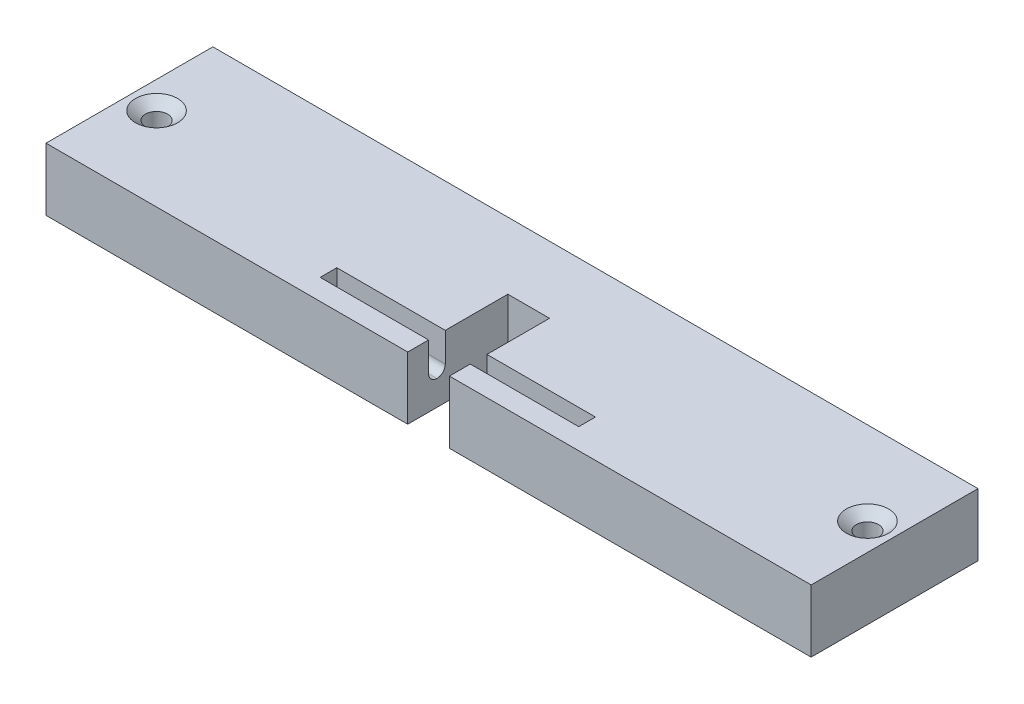
ISO-10303-21;
HEADER;
FILE_DESCRIPTION(('STEP AP214'),'2;1');
FILE_NAME('part.step','',(''),(''),'','','');
FILE_SCHEMA(('AUTOMOTIVE_DESIGN { 1 0 10303 214 1 1 1 1 }'));
ENDSEC;
DATA;
#1=APPLICATION_CONTEXT('core data for automotive mechanical design processes');
#2=APPLICATION_PROTOCOL_DEFINITION('international standard','automotive_design',2000,#1);
#3=PRODUCT_CONTEXT('',#1,'mechanical');
#4=PRODUCT('Part','Part','',(#3));
#5=PRODUCT_RELATED_PRODUCT_CATEGORY('part','',(#4));
#6=PRODUCT_DEFINITION_FORMATION('','',#4);
#7=PRODUCT_DEFINITION_CONTEXT('part definition',#1,'design');
#8=PRODUCT_DEFINITION('design','',#6,#7);
#9=PRODUCT_DEFINITION_SHAPE('','',#8);
#10=(LENGTH_UNIT() NAMED_UNIT(*) SI_UNIT(.MILLI.,.METRE.));
#11=(NAMED_UNIT(*) PLANE_ANGLE_UNIT() SI_UNIT($,.RADIAN.));
#12=(NAMED_UNIT(*) SI_UNIT($,.STERADIAN.) SOLID_ANGLE_UNIT());
#13=UNCERTAINTY_MEASURE_WITH_UNIT(LENGTH_MEASURE(1.E-05),#10,'distance_accuracy_value','');
#14=(GEOMETRIC_REPRESENTATION_CONTEXT(3) GLOBAL_UNCERTAINTY_ASSIGNED_CONTEXT((#13)) GLOBAL_UNIT_ASSIGNED_CONTEXT((#10,
#11,#12)) REPRESENTATION_CONTEXT('',''));
#15=CARTESIAN_POINT('',(0.,0.,0.));
#16=DIRECTION('',(0.,0.,1.));
#17=DIRECTION('',(1.,0.,0.));
#18=AXIS2_PLACEMENT_3D('',#15,#16,#17);
#19=CARTESIAN_POINT('',(-45.86,82.5,-0.0100000000000031));
#20=DIRECTION('',(0.,-1.,0.));
#21=DIRECTION('',(0.,0.,-1.));
#22=AXIS2_PLACEMENT_3D('',#19,#20,#21);
#23=PLANE('',#22);
#24=DIRECTION('',(0.,0.,1.));
#25=VECTOR('',#24,1.);
#26=CARTESIAN_POINT('',(-38.36,82.5,15.));
#27=LINE('',#26,#25);
#28=CARTESIAN_POINT('',(-38.36,82.5,4.99999999999998));
#29=VERTEX_POINT('',#28);
#30=CARTESIAN_POINT('',(-38.36,82.5,15.));
#31=VERTEX_POINT('',#30);
#32=EDGE_CURVE('E217',#29,#31,#27,.T.);
#33=ORIENTED_EDGE('',*,*,#32,.F.);
#34=DIRECTION('',(-0.499999999999998,0.,-0.86602540378444));
#35=VECTOR('',#34,1.);
#36=CARTESIAN_POINT('',(-38.36,82.5,5.));
#37=LINE('',#36,#35);
#38=CARTESIAN_POINT('',(-39.86,82.5,2.40192378864667));
#39=VERTEX_POINT('',#38);
#40=EDGE_CURVE('E246',#29,#39,#37,.T.);
#41=ORIENTED_EDGE('',*,*,#40,.T.);
#42=DIRECTION('',(0.,0.,-1.));
#43=VECTOR('',#42,1.);
#44=CARTESIAN_POINT('',(-39.86,82.5,0.));
#45=LINE('',#44,#43);
#46=CARTESIAN_POINT('',(-39.86,82.5,17.5980762113533));
#47=VERTEX_POINT('',#46);
#48=EDGE_CURVE('E243',#47,#39,#45,.T.);
#49=ORIENTED_EDGE('',*,*,#48,.F.);
#50=DIRECTION('',(0.499999999999998,0.,-0.86602540378444));
#51=VECTOR('',#50,1.);
#52=CARTESIAN_POINT('',(-38.36,82.5,15.));
#53=LINE('',#52,#51);
#54=EDGE_CURVE('E236',#47,#31,#53,.T.);
#55=ORIENTED_EDGE('',*,*,#54,.T.);
#56=EDGE_LOOP('',(#33,#41,#49,#55));
#57=FACE_BOUND('',#56,.T.);
#58=DIRECTION('',(-0.499999999999998,0.,0.86602540378444));
#59=VECTOR('',#58,1.);
#60=CARTESIAN_POINT('',(38.36,82.5,5.));
#61=LINE('',#60,#59);
#62=CARTESIAN_POINT('',(38.36,82.5,5.));
#63=VERTEX_POINT('',#62);
#64=CARTESIAN_POINT('',(39.86,82.5,2.40192378864667));
#65=VERTEX_POINT('',#64);
#66=EDGE_CURVE('E371',#63,#65,#61,.F.);
#67=ORIENTED_EDGE('',*,*,#66,.F.);
#68=DIRECTION('',(0.,0.,1.));
#69=VECTOR('',#68,1.);
#70=CARTESIAN_POINT('',(38.36,82.5,15.));
#71=LINE('',#70,#69);
#72=CARTESIAN_POINT('',(38.36,82.5,15.));
#73=VERTEX_POINT('',#72);
#74=EDGE_CURVE('E316',#63,#73,#71,.T.);
#75=ORIENTED_EDGE('',*,*,#74,.T.);
#76=DIRECTION('',(0.499999999999998,0.,0.86602540378444));
#77=VECTOR('',#76,1.);
#78=CARTESIAN_POINT('',(38.36,82.5,15.));
#79=LINE('',#78,#77);
#80=CARTESIAN_POINT('',(39.86,82.5,17.5980762113533));
#81=VERTEX_POINT('',#80);
#82=EDGE_CURVE('E374',#81,#73,#79,.F.);
#83=ORIENTED_EDGE('',*,*,#82,.F.);
#84=DIRECTION('',(0.,0.,1.));
#85=VECTOR('',#84,1.);
#86=CARTESIAN_POINT('',(39.86,82.5,0.));
#87=LINE('',#86,#85);
#88=EDGE_CURVE('E367',#65,#81,#87,.T.);
#89=ORIENTED_EDGE('',*,*,#88,.F.);
#90=EDGE_LOOP('',(#67,#75,#83,#89));
#91=FACE_BOUND('',#90,.T.);
#92=CARTESIAN_POINT('',(42.61,82.5,10.));
#93=DIRECTION('',(0.,-1.,0.));
#94=DIRECTION('',(0.,0.,-1.));
#95=AXIS2_PLACEMENT_3D('',#92,#93,#94);
#96=CIRCLE('',#95,1.3208);
#97=CARTESIAN_POINT('',(42.61,82.5,8.6792));
#98=VERTEX_POINT('',#97);
#99=EDGE_CURVE('E259',#98,#98,#96,.F.);
#100=ORIENTED_EDGE('',*,*,#99,.T.);
#101=EDGE_LOOP('',(#100));
#102=FACE_BOUND('',#101,.T.);
#103=DIRECTION('',(1.,0.,0.));
#104=VECTOR('',#103,1.);
#105=CARTESIAN_POINT('',(-38.36,82.5,0.));
#106=LINE('',#105,#104);
#107=CARTESIAN_POINT('',(-45.86,82.5,0.));
#108=VERTEX_POINT('',#107);
#109=CARTESIAN_POINT('',(45.86,82.5,0.));
#110=VERTEX_POINT('',#109);
#111=EDGE_CURVE('E545',#108,#110,#106,.T.);
#112=ORIENTED_EDGE('',*,*,#111,.T.);
#113=DIRECTION('',(0.,0.,1.));
#114=VECTOR('',#113,1.);
#115=CARTESIAN_POINT('',(45.86,82.5,-0.0100000000000031));
#116=LINE('',#115,#114);
#117=CARTESIAN_POINT('',(45.86,82.5,20.));
#118=VERTEX_POINT('',#117);
#119=EDGE_CURVE('E252',#110,#118,#116,.T.);
#120=ORIENTED_EDGE('',*,*,#119,.T.);
#121=DIRECTION('',(-1.,0.,0.));
#122=VECTOR('',#121,1.);
#123=CARTESIAN_POINT('',(38.36,82.5,20.));
#124=LINE('',#123,#122);
#125=CARTESIAN_POINT('',(2.49999999999999,82.5,20.));
#126=VERTEX_POINT('',#125);
#127=EDGE_CURVE('E293',#118,#126,#124,.T.);
#128=ORIENTED_EDGE('',*,*,#127,.T.);
#129=DIRECTION('',(0.,0.,-1.));
#130=VECTOR('',#129,1.);
#131=CARTESIAN_POINT('',(2.49999999999999,82.5,20.));
#132=LINE('',#131,#130);
#133=CARTESIAN_POINT('',(2.49999999999999,82.5,8.));
#134=VERTEX_POINT('',#133);
#135=EDGE_CURVE('E319',#126,#134,#132,.T.);
#136=ORIENTED_EDGE('',*,*,#135,.T.);
#137=DIRECTION('',(1.,0.,0.));
#138=VECTOR('',#137,1.);
#139=CARTESIAN_POINT('',(-2.50000000000001,82.5,8.));
#140=LINE('',#139,#138);
#141=CARTESIAN_POINT('',(-2.50000000000001,82.5,8.));
#142=VERTEX_POINT('',#141);
#143=EDGE_CURVE('E389',#142,#134,#140,.T.);
#144=ORIENTED_EDGE('',*,*,#143,.F.);
#145=DIRECTION('',(0.,0.,-1.));
#146=VECTOR('',#145,1.);
#147=CARTESIAN_POINT('',(-2.50000000000001,82.5,20.));
#148=LINE('',#147,#146);
#149=CARTESIAN_POINT('',(-2.50000000000001,82.5,20.));
#150=VERTEX_POINT('',#149);
#151=EDGE_CURVE('E403',#150,#142,#148,.T.);
#152=ORIENTED_EDGE('',*,*,#151,.F.);
#153=DIRECTION('',(1.,0.,0.));
#154=VECTOR('',#153,1.);
#155=CARTESIAN_POINT('',(-38.36,82.5,20.));
#156=LINE('',#155,#154);
#157=CARTESIAN_POINT('',(-45.86,82.5,20.));
#158=VERTEX_POINT('',#157);
#159=EDGE_CURVE('E240',#158,#150,#156,.T.);
#160=ORIENTED_EDGE('',*,*,#159,.F.);
#161=DIRECTION('',(0.,0.,-1.));
#162=VECTOR('',#161,1.);
#163=CARTESIAN_POINT('',(-45.86,82.5,20.));
#164=LINE('',#163,#162);
#165=EDGE_CURVE('E245',#158,#108,#164,.T.);
#166=ORIENTED_EDGE('',*,*,#165,.T.);
#167=EDGE_LOOP('',(#112,#120,#128,#136,#144,#152,#160,#166));
#168=FACE_BOUND('',#167,.T.);
#169=CARTESIAN_POINT('',(-42.61,82.5,10.));
#170=DIRECTION('',(0.,-1.,0.));
#171=DIRECTION('',(0.,0.,-1.));
#172=AXIS2_PLACEMENT_3D('',#169,#170,#171);
#173=CIRCLE('',#172,1.3208);
#174=CARTESIAN_POINT('',(-42.61,82.5,8.6792));
#175=VERTEX_POINT('',#174);
#176=EDGE_CURVE('E263',#175,#175,#173,.F.);
#177=ORIENTED_EDGE('',*,*,#176,.T.);
#178=EDGE_LOOP('',(#177));
#179=FACE_BOUND('',#178,.T.);
#180=ADVANCED_FACE('F47',(#57,#91,#102,#168,#179),#23,.T.);
#181=CARTESIAN_POINT('',(-45.86,90.,20.));
#182=DIRECTION('',(0.,1.,0.));
#183=DIRECTION('',(0.,0.,1.));
#184=AXIS2_PLACEMENT_3D('',#181,#182,#183);
#185=PLANE('',#184);
#186=CARTESIAN_POINT('',(-42.61,90.,10.));
#187=DIRECTION('',(0.,1.,0.));
#188=DIRECTION('',(0.,0.,1.));
#189=AXIS2_PLACEMENT_3D('',#186,#187,#188);
#190=CIRCLE('',#189,2.5273);
#191=CARTESIAN_POINT('',(-42.61,90.,12.5273));
#192=VERTEX_POINT('',#191);
#193=EDGE_CURVE('E11',#192,#192,#190,.T.);
#194=ORIENTED_EDGE('',*,*,#193,.F.);
#195=EDGE_LOOP('',(#194));
#196=FACE_BOUND('',#195,.T.);
#197=CARTESIAN_POINT('',(42.61,90.,10.));
#198=DIRECTION('',(0.,1.,0.));
#199=DIRECTION('',(0.,0.,1.));
#200=AXIS2_PLACEMENT_3D('',#197,#198,#199);
#201=CIRCLE('',#200,2.5273);
#202=CARTESIAN_POINT('',(42.61,90.,12.5273));
#203=VERTEX_POINT('',#202);
#204=EDGE_CURVE('E360',#203,#203,#201,.T.);
#205=ORIENTED_EDGE('',*,*,#204,.F.);
#206=EDGE_LOOP('',(#205));
#207=FACE_BOUND('',#206,.T.);
#208=DIRECTION('',(0.,0.,1.));
#209=VECTOR('',#208,1.);
#210=CARTESIAN_POINT('',(2.49999999999999,90.,20.));
#211=LINE('',#210,#209);
#212=CARTESIAN_POINT('',(2.49999999999999,90.,8.));
#213=VERTEX_POINT('',#212);
#214=CARTESIAN_POINT('',(2.49999999999999,90.,15.5));
#215=VERTEX_POINT('',#214);
#216=EDGE_CURVE('E327',#213,#215,#211,.T.);
#217=ORIENTED_EDGE('',*,*,#216,.T.);
#218=DIRECTION('',(-1.,0.,0.));
#219=VECTOR('',#218,1.);
#220=CARTESIAN_POINT('',(15.5,90.,15.5));
#221=LINE('',#220,#219);
#222=CARTESIAN_POINT('',(15.5,90.,15.5));
#223=VERTEX_POINT('',#222);
#224=EDGE_CURVE('E335',#223,#215,#221,.T.);
#225=ORIENTED_EDGE('',*,*,#224,.F.);
#226=DIRECTION('',(0.,0.,1.));
#227=VECTOR('',#226,1.);
#228=CARTESIAN_POINT('',(15.5,90.,17.5));
#229=LINE('',#228,#227);
#230=CARTESIAN_POINT('',(15.5,90.,17.5));
#231=VERTEX_POINT('',#230);
#232=EDGE_CURVE('E339',#223,#231,#229,.T.);
#233=ORIENTED_EDGE('',*,*,#232,.T.);
#234=DIRECTION('',(-1.,0.,0.));
#235=VECTOR('',#234,1.);
#236=CARTESIAN_POINT('',(15.5,90.,17.5));
#237=LINE('',#236,#235);
#238=CARTESIAN_POINT('',(2.49999999999999,90.,17.5));
#239=VERTEX_POINT('',#238);
#240=EDGE_CURVE('E336',#231,#239,#237,.T.);
#241=ORIENTED_EDGE('',*,*,#240,.T.);
#242=CARTESIAN_POINT('',(2.49999999999999,90.,20.));
#243=VERTEX_POINT('',#242);
#244=EDGE_CURVE('E86',#239,#243,#211,.T.);
#245=ORIENTED_EDGE('',*,*,#244,.T.);
#246=DIRECTION('',(-1.,0.,0.));
#247=VECTOR('',#246,1.);
#248=CARTESIAN_POINT('',(45.86,90.,20.));
#249=LINE('',#248,#247);
#250=CARTESIAN_POINT('',(45.86,90.,20.));
#251=VERTEX_POINT('',#250);
#252=EDGE_CURVE('E288',#251,#243,#249,.T.);
#253=ORIENTED_EDGE('',*,*,#252,.F.);
#254=DIRECTION('',(0.,0.,-1.));
#255=VECTOR('',#254,1.);
#256=CARTESIAN_POINT('',(45.86,90.,20.));
#257=LINE('',#256,#255);
#258=CARTESIAN_POINT('',(45.86,90.,0.));
#259=VERTEX_POINT('',#258);
#260=EDGE_CURVE('E289',#251,#259,#257,.T.);
#261=ORIENTED_EDGE('',*,*,#260,.T.);
#262=DIRECTION('',(1.,0.,0.));
#263=VECTOR('',#262,1.);
#264=CARTESIAN_POINT('',(-45.86,90.,0.));
#265=LINE('',#264,#263);
#266=CARTESIAN_POINT('',(-45.86,90.,0.));
#267=VERTEX_POINT('',#266);
#268=EDGE_CURVE('E277',#267,#259,#265,.T.);
#269=ORIENTED_EDGE('',*,*,#268,.F.);
#270=DIRECTION('',(0.,0.,-1.));
#271=VECTOR('',#270,1.);
#272=CARTESIAN_POINT('',(-45.86,90.,20.));
#273=LINE('',#272,#271);
#274=CARTESIAN_POINT('',(-45.86,90.,20.));
#275=VERTEX_POINT('',#274);
#276=EDGE_CURVE('E272',#275,#267,#273,.T.);
#277=ORIENTED_EDGE('',*,*,#276,.F.);
#278=DIRECTION('',(1.,0.,0.));
#279=VECTOR('',#278,1.);
#280=CARTESIAN_POINT('',(-45.86,90.,20.));
#281=LINE('',#280,#279);
#282=CARTESIAN_POINT('',(-2.50000000000001,90.,20.));
#283=VERTEX_POINT('',#282);
#284=EDGE_CURVE('E271',#275,#283,#281,.T.);
#285=ORIENTED_EDGE('',*,*,#284,.T.);
#286=DIRECTION('',(0.,0.,1.));
#287=VECTOR('',#286,1.);
#288=CARTESIAN_POINT('',(-2.50000000000001,90.,20.));
#289=LINE('',#288,#287);
#290=CARTESIAN_POINT('',(-2.50000000000001,90.,17.5));
#291=VERTEX_POINT('',#290);
#292=EDGE_CURVE('E398',#291,#283,#289,.T.);
#293=ORIENTED_EDGE('',*,*,#292,.F.);
#294=DIRECTION('',(1.,0.,0.));
#295=VECTOR('',#294,1.);
#296=CARTESIAN_POINT('',(-15.5,90.,17.5));
#297=LINE('',#296,#295);
#298=CARTESIAN_POINT('',(-15.5,90.,17.5));
#299=VERTEX_POINT('',#298);
#300=EDGE_CURVE('E410',#299,#291,#297,.T.);
#301=ORIENTED_EDGE('',*,*,#300,.F.);
#302=DIRECTION('',(0.,0.,1.));
#303=VECTOR('',#302,1.);
#304=CARTESIAN_POINT('',(-15.5,90.,17.5));
#305=LINE('',#304,#303);
#306=CARTESIAN_POINT('',(-15.5,90.,15.5));
#307=VERTEX_POINT('',#306);
#308=EDGE_CURVE('E429',#307,#299,#305,.T.);
#309=ORIENTED_EDGE('',*,*,#308,.F.);
#310=DIRECTION('',(1.,0.,0.));
#311=VECTOR('',#310,1.);
#312=CARTESIAN_POINT('',(-15.5,90.,15.5));
#313=LINE('',#312,#311);
#314=CARTESIAN_POINT('',(-2.50000000000001,90.,15.5));
#315=VERTEX_POINT('',#314);
#316=EDGE_CURVE('E411',#307,#315,#313,.T.);
#317=ORIENTED_EDGE('',*,*,#316,.T.);
#318=CARTESIAN_POINT('',(-2.50000000000001,90.,8.));
#319=VERTEX_POINT('',#318);
#320=EDGE_CURVE('E392',#319,#315,#289,.T.);
#321=ORIENTED_EDGE('',*,*,#320,.F.);
#322=DIRECTION('',(1.,0.,0.));
#323=VECTOR('',#322,1.);
#324=CARTESIAN_POINT('',(-2.50000000000001,90.,8.));
#325=LINE('',#324,#323);
#326=EDGE_CURVE('E230',#319,#213,#325,.T.);
#327=ORIENTED_EDGE('',*,*,#326,.T.);
#328=EDGE_LOOP('',(#217,#225,#233,#241,#245,#253,#261,#269,#277,#285,#293,#301,#309,#317,#321,#327));
#329=FACE_BOUND('',#328,.T.);
#330=ADVANCED_FACE('F454',(#196,#207,#329),#185,.T.);
#331=CARTESIAN_POINT('',(-42.61,90.,10.));
#332=DIRECTION('',(0.,1.,0.));
#333=DIRECTION('',(0.,0.,1.));
#334=AXIS2_PLACEMENT_3D('',#331,#332,#333);
#335=CYLINDRICAL_SURFACE('',#334,1.3208);
#336=CARTESIAN_POINT('',(-42.61,88.9876262949846,10.));
#337=DIRECTION('',(0.,1.,0.));
#338=DIRECTION('',(0.,0.,1.));
#339=AXIS2_PLACEMENT_3D('',#336,#337,#338);
#340=CIRCLE('',#339,1.3208);
#341=CARTESIAN_POINT('',(-42.61,88.9876262949846,11.3208));
#342=VERTEX_POINT('',#341);
#343=EDGE_CURVE('E58',#342,#342,#340,.T.);
#344=ORIENTED_EDGE('',*,*,#343,.T.);
#345=EDGE_LOOP('',(#344));
#346=FACE_BOUND('',#345,.T.);
#347=ORIENTED_EDGE('',*,*,#176,.F.);
#348=EDGE_LOOP('',(#347));
#349=FACE_BOUND('',#348,.T.);
#350=ADVANCED_FACE('F49',(#346,#349),#335,.F.);
#351=CARTESIAN_POINT('',(-42.61,90.,10.));
#352=DIRECTION('',(0.,1.,0.));
#353=DIRECTION('',(0.,0.,1.));
#354=AXIS2_PLACEMENT_3D('',#351,#352,#353);
#355=CONICAL_SURFACE('',#354,2.5273,0.872664625997166);
#356=ORIENTED_EDGE('',*,*,#343,.F.);
#357=EDGE_LOOP('',(#356));
#358=FACE_BOUND('',#357,.T.);
#359=ORIENTED_EDGE('',*,*,#193,.T.);
#360=EDGE_LOOP('',(#359));
#361=FACE_BOUND('',#360,.T.);
#362=ADVANCED_FACE('F461',(#358,#361),#355,.F.);
#363=CARTESIAN_POINT('',(42.61,90.,10.));
#364=DIRECTION('',(0.,1.,0.));
#365=DIRECTION('',(0.,0.,1.));
#366=AXIS2_PLACEMENT_3D('',#363,#364,#365);
#367=CYLINDRICAL_SURFACE('',#366,1.3208);
#368=CARTESIAN_POINT('',(42.61,88.9876262949846,10.));
#369=DIRECTION('',(0.,1.,0.));
#370=DIRECTION('',(0.,0.,1.));
#371=AXIS2_PLACEMENT_3D('',#368,#369,#370);
#372=CIRCLE('',#371,1.3208);
#373=CARTESIAN_POINT('',(42.61,88.9876262949846,11.3208));
#374=VERTEX_POINT('',#373);
#375=EDGE_CURVE('E347',#374,#374,#372,.T.);
#376=ORIENTED_EDGE('',*,*,#375,.T.);
#377=EDGE_LOOP('',(#376));
#378=FACE_BOUND('',#377,.T.);
#379=ORIENTED_EDGE('',*,*,#99,.F.);
#380=EDGE_LOOP('',(#379));
#381=FACE_BOUND('',#380,.T.);
#382=ADVANCED_FACE('F460',(#378,#381),#367,.F.);
#383=CARTESIAN_POINT('',(42.61,90.,10.));
#384=DIRECTION('',(0.,1.,0.));
#385=DIRECTION('',(0.,0.,1.));
#386=AXIS2_PLACEMENT_3D('',#383,#384,#385);
#387=CONICAL_SURFACE('',#386,2.5273,0.872664625997166);
#388=ORIENTED_EDGE('',*,*,#375,.F.);
#389=EDGE_LOOP('',(#388));
#390=FACE_BOUND('',#389,.T.);
#391=ORIENTED_EDGE('',*,*,#204,.T.);
#392=EDGE_LOOP('',(#391));
#393=FACE_BOUND('',#392,.T.);
#394=ADVANCED_FACE('F475',(#390,#393),#387,.F.);
#395=CARTESIAN_POINT('',(2.5,0.,0.));
#396=DIRECTION('',(-1.,0.,0.));
#397=DIRECTION('',(0.,1.,0.));
#398=AXIS2_PLACEMENT_3D('',#395,#396,#397);
#399=PLANE('',#398);
#400=DIRECTION('',(0.,-1.,0.));
#401=VECTOR('',#400,1.);
#402=CARTESIAN_POINT('',(2.49999999999999,90.,17.5));
#403=LINE('',#402,#401);
#404=CARTESIAN_POINT('',(2.49999999999999,86.5,17.5));
#405=VERTEX_POINT('',#404);
#406=EDGE_CURVE('E67',#239,#405,#403,.T.);
#407=ORIENTED_EDGE('',*,*,#406,.T.);
#408=CARTESIAN_POINT('',(2.49999999999999,86.5,16.5));
#409=DIRECTION('',(-1.,0.,0.));
#410=DIRECTION('',(0.,-1.,0.));
#411=AXIS2_PLACEMENT_3D('',#408,#409,#410);
#412=CIRCLE('',#411,1.);
#413=CARTESIAN_POINT('',(2.49999999999999,85.5,16.5));
#414=VERTEX_POINT('',#413);
#415=EDGE_CURVE('E594',#405,#414,#412,.F.);
#416=ORIENTED_EDGE('',*,*,#415,.T.);
#417=CARTESIAN_POINT('',(2.49999999999999,86.5,16.5));
#418=DIRECTION('',(-1.,0.,0.));
#419=DIRECTION('',(0.,-1.,0.));
#420=AXIS2_PLACEMENT_3D('',#417,#418,#419);
#421=CIRCLE('',#420,1.);
#422=CARTESIAN_POINT('',(2.49999999999999,86.5,15.5));
#423=VERTEX_POINT('',#422);
#424=EDGE_CURVE('E370',#414,#423,#421,.F.);
#425=ORIENTED_EDGE('',*,*,#424,.T.);
#426=DIRECTION('',(0.,1.,0.));
#427=VECTOR('',#426,1.);
#428=CARTESIAN_POINT('',(2.49999999999999,90.,15.5));
#429=LINE('',#428,#427);
#430=EDGE_CURVE('E344',#423,#215,#429,.T.);
#431=ORIENTED_EDGE('',*,*,#430,.T.);
#432=ORIENTED_EDGE('',*,*,#216,.F.);
#433=DIRECTION('',(0.,1.,0.));
#434=VECTOR('',#433,1.);
#435=CARTESIAN_POINT('',(2.49999999999999,90.,8.));
#436=LINE('',#435,#434);
#437=EDGE_CURVE('E323',#134,#213,#436,.T.);
#438=ORIENTED_EDGE('',*,*,#437,.F.);
#439=ORIENTED_EDGE('',*,*,#135,.F.);
#440=DIRECTION('',(0.,-1.,0.));
#441=VECTOR('',#440,1.);
#442=CARTESIAN_POINT('',(2.49999999999999,90.,20.));
#443=LINE('',#442,#441);
#444=EDGE_CURVE('E331',#243,#126,#443,.T.);
#445=ORIENTED_EDGE('',*,*,#444,.F.);
#446=ORIENTED_EDGE('',*,*,#244,.F.);
#447=EDGE_LOOP('',(#407,#416,#425,#431,#432,#438,#439,#445,#446));
#448=FACE_BOUND('',#447,.T.);
#449=ADVANCED_FACE('F498',(#448),#399,.T.);
#450=CARTESIAN_POINT('',(15.5,90.,17.5));
#451=DIRECTION('',(0.,0.,-1.));
#452=DIRECTION('',(-1.,0.,0.));
#453=AXIS2_PLACEMENT_3D('',#450,#451,#452);
#454=PLANE('',#453);
#455=DIRECTION('',(0.,-1.,0.));
#456=VECTOR('',#455,1.);
#457=CARTESIAN_POINT('',(15.5,90.,17.5));
#458=LINE('',#457,#456);
#459=CARTESIAN_POINT('',(15.5,86.5,17.5));
#460=VERTEX_POINT('',#459);
#461=EDGE_CURVE('E351',#231,#460,#458,.T.);
#462=ORIENTED_EDGE('',*,*,#461,.T.);
#463=DIRECTION('',(-1.,0.,0.));
#464=VECTOR('',#463,1.);
#465=CARTESIAN_POINT('',(2.49999999999999,86.5,17.5));
#466=LINE('',#465,#464);
#467=EDGE_CURVE('E584',#460,#405,#466,.T.);
#468=ORIENTED_EDGE('',*,*,#467,.T.);
#469=ORIENTED_EDGE('',*,*,#406,.F.);
#470=ORIENTED_EDGE('',*,*,#240,.F.);
#471=EDGE_LOOP('',(#462,#468,#469,#470));
#472=FACE_BOUND('',#471,.T.);
#473=ADVANCED_FACE('F501',(#472),#454,.T.);
#474=CARTESIAN_POINT('',(15.5,86.5,16.5));
#475=DIRECTION('',(1.,0.,0.));
#476=DIRECTION('',(0.,1.,0.));
#477=AXIS2_PLACEMENT_3D('',#474,#475,#476);
#478=CYLINDRICAL_SURFACE('',#477,1.);
#479=CARTESIAN_POINT('',(15.5,86.5,16.5));
#480=DIRECTION('',(-1.,0.,0.));
#481=DIRECTION('',(0.,-1.,0.));
#482=AXIS2_PLACEMENT_3D('',#479,#480,#481);
#483=CIRCLE('',#482,1.);
#484=CARTESIAN_POINT('',(15.5,85.5,16.5));
#485=VERTEX_POINT('',#484);
#486=EDGE_CURVE('E591',#485,#460,#483,.T.);
#487=ORIENTED_EDGE('',*,*,#486,.F.);
#488=DIRECTION('',(-1.,0.,0.));
#489=VECTOR('',#488,1.);
#490=CARTESIAN_POINT('',(15.5,85.5,16.5));
#491=LINE('',#490,#489);
#492=EDGE_CURVE('E587',#414,#485,#491,.F.);
#493=ORIENTED_EDGE('',*,*,#492,.F.);
#494=ORIENTED_EDGE('',*,*,#415,.F.);
#495=ORIENTED_EDGE('',*,*,#467,.F.);
#496=EDGE_LOOP('',(#487,#493,#494,#495));
#497=FACE_BOUND('',#496,.T.);
#498=ADVANCED_FACE('F510',(#497),#478,.F.);
#499=CARTESIAN_POINT('',(15.5,86.5,16.5));
#500=DIRECTION('',(1.,0.,0.));
#501=DIRECTION('',(0.,1.,0.));
#502=AXIS2_PLACEMENT_3D('',#499,#500,#501);
#503=CYLINDRICAL_SURFACE('',#502,1.);
#504=CARTESIAN_POINT('',(15.5,86.5,16.5));
#505=DIRECTION('',(-1.,0.,0.));
#506=DIRECTION('',(0.,-1.,0.));
#507=AXIS2_PLACEMENT_3D('',#504,#505,#506);
#508=CIRCLE('',#507,1.);
#509=CARTESIAN_POINT('',(15.5,86.5,15.5));
#510=VERTEX_POINT('',#509);
#511=EDGE_CURVE('E601',#510,#485,#508,.T.);
#512=ORIENTED_EDGE('',*,*,#511,.F.);
#513=DIRECTION('',(-1.,0.,0.));
#514=VECTOR('',#513,1.);
#515=CARTESIAN_POINT('',(15.5,86.5,15.5));
#516=LINE('',#515,#514);
#517=EDGE_CURVE('E598',#423,#510,#516,.F.);
#518=ORIENTED_EDGE('',*,*,#517,.F.);
#519=ORIENTED_EDGE('',*,*,#424,.F.);
#520=ORIENTED_EDGE('',*,*,#492,.T.);
#521=EDGE_LOOP('',(#512,#518,#519,#520));
#522=FACE_BOUND('',#521,.T.);
#523=ADVANCED_FACE('F507',(#522),#503,.F.);
#524=CARTESIAN_POINT('',(15.5,90.,15.5));
#525=DIRECTION('',(0.,0.,1.));
#526=DIRECTION('',(1.,0.,0.));
#527=AXIS2_PLACEMENT_3D('',#524,#525,#526);
#528=PLANE('',#527);
#529=ORIENTED_EDGE('',*,*,#430,.F.);
#530=ORIENTED_EDGE('',*,*,#517,.T.);
#531=DIRECTION('',(0.,1.,0.));
#532=VECTOR('',#531,1.);
#533=CARTESIAN_POINT('',(15.5,90.,15.5));
#534=LINE('',#533,#532);
#535=EDGE_CURVE('E79',#510,#223,#534,.T.);
#536=ORIENTED_EDGE('',*,*,#535,.T.);
#537=ORIENTED_EDGE('',*,*,#224,.T.);
#538=EDGE_LOOP('',(#529,#530,#536,#537));
#539=FACE_BOUND('',#538,.T.);
#540=ADVANCED_FACE('F503',(#539),#528,.T.);
#541=CARTESIAN_POINT('',(15.5,0.,0.));
#542=DIRECTION('',(-1.,0.,0.));
#543=DIRECTION('',(0.,1.,0.));
#544=AXIS2_PLACEMENT_3D('',#541,#542,#543);
#545=PLANE('',#544);
#546=ORIENTED_EDGE('',*,*,#535,.F.);
#547=ORIENTED_EDGE('',*,*,#511,.T.);
#548=ORIENTED_EDGE('',*,*,#486,.T.);
#549=ORIENTED_EDGE('',*,*,#461,.F.);
#550=ORIENTED_EDGE('',*,*,#232,.F.);
#551=EDGE_LOOP('',(#546,#547,#548,#549,#550));
#552=FACE_BOUND('',#551,.T.);
#553=ADVANCED_FACE('F506',(#552),#545,.T.);
#554=CARTESIAN_POINT('',(0.,0.,20.));
#555=DIRECTION('',(0.,0.,-1.));
#556=DIRECTION('',(-1.,0.,0.));
#557=AXIS2_PLACEMENT_3D('',#554,#555,#556);
#558=PLANE('',#557);
#559=ORIENTED_EDGE('',*,*,#127,.F.);
#560=DIRECTION('',(0.,-1.,0.));
#561=VECTOR('',#560,1.);
#562=CARTESIAN_POINT('',(45.86,90.,20.));
#563=LINE('',#562,#561);
#564=EDGE_CURVE('E284',#251,#118,#563,.T.);
#565=ORIENTED_EDGE('',*,*,#564,.F.);
#566=ORIENTED_EDGE('',*,*,#252,.T.);
#567=ORIENTED_EDGE('',*,*,#444,.T.);
#568=EDGE_LOOP('',(#559,#565,#566,#567));
#569=FACE_BOUND('',#568,.T.);
#570=ADVANCED_FACE('F449',(#569),#558,.F.);
#571=CARTESIAN_POINT('',(-2.50000000000001,90.,8.));
#572=DIRECTION('',(0.,0.,-1.));
#573=DIRECTION('',(0.,1.,0.));
#574=AXIS2_PLACEMENT_3D('',#571,#572,#573);
#575=PLANE('',#574);
#576=ORIENTED_EDGE('',*,*,#143,.T.);
#577=ORIENTED_EDGE('',*,*,#437,.T.);
#578=ORIENTED_EDGE('',*,*,#326,.F.);
#579=DIRECTION('',(0.,1.,0.));
#580=VECTOR('',#579,1.);
#581=CARTESIAN_POINT('',(-2.50000000000001,90.,8.));
#582=LINE('',#581,#580);
#583=EDGE_CURVE('E399',#142,#319,#582,.T.);
#584=ORIENTED_EDGE('',*,*,#583,.F.);
#585=EDGE_LOOP('',(#576,#577,#578,#584));
#586=FACE_BOUND('',#585,.T.);
#587=ADVANCED_FACE('F524',(#586),#575,.F.);
#588=DIRECTION('',(0.,-1.,0.));
#589=VECTOR('',#588,1.);
#590=CARTESIAN_POINT('',(-45.86,90.,20.));
#591=LINE('',#590,#589);
#592=EDGE_CURVE('E267',#275,#158,#591,.T.);
#593=ORIENTED_EDGE('',*,*,#592,.T.);
#594=ORIENTED_EDGE('',*,*,#159,.T.);
#595=DIRECTION('',(0.,-1.,0.));
#596=VECTOR('',#595,1.);
#597=CARTESIAN_POINT('',(-2.50000000000001,90.,20.));
#598=LINE('',#597,#596);
#599=EDGE_CURVE('E407',#283,#150,#598,.T.);
#600=ORIENTED_EDGE('',*,*,#599,.F.);
#601=ORIENTED_EDGE('',*,*,#284,.F.);
#602=EDGE_LOOP('',(#593,#594,#600,#601));
#603=FACE_BOUND('',#602,.T.);
#604=ADVANCED_FACE('F525',(#603),#558,.F.);
#605=CARTESIAN_POINT('',(-2.5,0.,0.));
#606=DIRECTION('',(1.,0.,0.));
#607=DIRECTION('',(0.,1.,0.));
#608=AXIS2_PLACEMENT_3D('',#605,#606,#607);
#609=PLANE('',#608);
#610=DIRECTION('',(0.,1.,0.));
#611=VECTOR('',#610,1.);
#612=CARTESIAN_POINT('',(-2.50000000000001,90.,15.5));
#613=LINE('',#612,#611);
#614=CARTESIAN_POINT('',(-2.50000000000001,86.5,15.5));
#615=VERTEX_POINT('',#614);
#616=EDGE_CURVE('E422',#615,#315,#613,.T.);
#617=ORIENTED_EDGE('',*,*,#616,.F.);
#618=CARTESIAN_POINT('',(-2.50000000000001,86.5,16.5));
#619=DIRECTION('',(1.,0.,0.));
#620=DIRECTION('',(0.,1.,0.));
#621=AXIS2_PLACEMENT_3D('',#618,#619,#620);
#622=CIRCLE('',#621,1.);
#623=CARTESIAN_POINT('',(-2.50000000000001,85.5,16.5));
#624=VERTEX_POINT('',#623);
#625=EDGE_CURVE('E581',#615,#624,#622,.F.);
#626=ORIENTED_EDGE('',*,*,#625,.T.);
#627=CARTESIAN_POINT('',(-2.50000000000001,86.5,16.5));
#628=DIRECTION('',(1.,0.,0.));
#629=DIRECTION('',(0.,1.,0.));
#630=AXIS2_PLACEMENT_3D('',#627,#628,#629);
#631=CIRCLE('',#630,1.);
#632=CARTESIAN_POINT('',(-2.50000000000001,86.5,17.5));
#633=VERTEX_POINT('',#632);
#634=EDGE_CURVE('E571',#624,#633,#631,.F.);
#635=ORIENTED_EDGE('',*,*,#634,.T.);
#636=DIRECTION('',(0.,-1.,0.));
#637=VECTOR('',#636,1.);
#638=CARTESIAN_POINT('',(-2.50000000000001,90.,17.5));
#639=LINE('',#638,#637);
#640=EDGE_CURVE('E418',#291,#633,#639,.T.);
#641=ORIENTED_EDGE('',*,*,#640,.F.);
#642=ORIENTED_EDGE('',*,*,#292,.T.);
#643=ORIENTED_EDGE('',*,*,#599,.T.);
#644=ORIENTED_EDGE('',*,*,#151,.T.);
#645=ORIENTED_EDGE('',*,*,#583,.T.);
#646=ORIENTED_EDGE('',*,*,#320,.T.);
#647=EDGE_LOOP('',(#617,#626,#635,#641,#642,#643,#644,#645,#646));
#648=FACE_BOUND('',#647,.T.);
#649=ADVANCED_FACE('F628',(#648),#609,.T.);
#650=CARTESIAN_POINT('',(-15.5,90.,17.5));
#651=DIRECTION('',(0.,0.,1.));
#652=DIRECTION('',(1.,0.,0.));
#653=AXIS2_PLACEMENT_3D('',#650,#651,#652);
#654=PLANE('',#653);
#655=ORIENTED_EDGE('',*,*,#640,.T.);
#656=DIRECTION('',(1.,0.,0.));
#657=VECTOR('',#656,1.);
#658=CARTESIAN_POINT('',(-15.5,86.5,17.5));
#659=LINE('',#658,#657);
#660=CARTESIAN_POINT('',(-15.5,86.5,17.5));
#661=VERTEX_POINT('',#660);
#662=EDGE_CURVE('E563',#633,#661,#659,.F.);
#663=ORIENTED_EDGE('',*,*,#662,.T.);
#664=DIRECTION('',(0.,-1.,0.));
#665=VECTOR('',#664,1.);
#666=CARTESIAN_POINT('',(-15.5,90.,17.5));
#667=LINE('',#666,#665);
#668=EDGE_CURVE('E415',#299,#661,#667,.T.);
#669=ORIENTED_EDGE('',*,*,#668,.F.);
#670=ORIENTED_EDGE('',*,*,#300,.T.);
#671=EDGE_LOOP('',(#655,#663,#669,#670));
#672=FACE_BOUND('',#671,.T.);
#673=ADVANCED_FACE('F634',(#672),#654,.F.);
#674=CARTESIAN_POINT('',(-15.5,90.,15.5));
#675=DIRECTION('',(0.,0.,-1.));
#676=DIRECTION('',(-1.,0.,0.));
#677=AXIS2_PLACEMENT_3D('',#674,#675,#676);
#678=PLANE('',#677);
#679=DIRECTION('',(0.,1.,0.));
#680=VECTOR('',#679,1.);
#681=CARTESIAN_POINT('',(-15.5,90.,15.5));
#682=LINE('',#681,#680);
#683=CARTESIAN_POINT('',(-15.5,86.5,15.5));
#684=VERTEX_POINT('',#683);
#685=EDGE_CURVE('E423',#684,#307,#682,.T.);
#686=ORIENTED_EDGE('',*,*,#685,.F.);
#687=DIRECTION('',(1.,0.,0.));
#688=VECTOR('',#687,1.);
#689=CARTESIAN_POINT('',(-2.50000000000001,86.5,15.5));
#690=LINE('',#689,#688);
#691=EDGE_CURVE('E574',#684,#615,#690,.T.);
#692=ORIENTED_EDGE('',*,*,#691,.T.);
#693=ORIENTED_EDGE('',*,*,#616,.T.);
#694=ORIENTED_EDGE('',*,*,#316,.F.);
#695=EDGE_LOOP('',(#686,#692,#693,#694));
#696=FACE_BOUND('',#695,.T.);
#697=ADVANCED_FACE('F642',(#696),#678,.F.);
#698=CARTESIAN_POINT('',(-15.5,86.5,16.5));
#699=DIRECTION('',(-1.,0.,0.));
#700=DIRECTION('',(0.,-1.,0.));
#701=AXIS2_PLACEMENT_3D('',#698,#699,#700);
#702=CYLINDRICAL_SURFACE('',#701,1.);
#703=CARTESIAN_POINT('',(-15.5,86.5,16.5));
#704=DIRECTION('',(1.,0.,0.));
#705=DIRECTION('',(0.,1.,0.));
#706=AXIS2_PLACEMENT_3D('',#703,#704,#705);
#707=CIRCLE('',#706,1.);
#708=CARTESIAN_POINT('',(-15.5,85.5,16.5));
#709=VERTEX_POINT('',#708);
#710=EDGE_CURVE('E578',#709,#684,#707,.T.);
#711=ORIENTED_EDGE('',*,*,#710,.F.);
#712=DIRECTION('',(1.,0.,0.));
#713=VECTOR('',#712,1.);
#714=CARTESIAN_POINT('',(-2.50000000000001,85.5,16.5));
#715=LINE('',#714,#713);
#716=EDGE_CURVE('E560',#709,#624,#715,.T.);
#717=ORIENTED_EDGE('',*,*,#716,.T.);
#718=ORIENTED_EDGE('',*,*,#625,.F.);
#719=ORIENTED_EDGE('',*,*,#691,.F.);
#720=EDGE_LOOP('',(#711,#717,#718,#719));
#721=FACE_BOUND('',#720,.T.);
#722=ADVANCED_FACE('F647',(#721),#702,.F.);
#723=CARTESIAN_POINT('',(-15.5,86.5,16.5));
#724=DIRECTION('',(-1.,0.,0.));
#725=DIRECTION('',(0.,-1.,0.));
#726=AXIS2_PLACEMENT_3D('',#723,#724,#725);
#727=CYLINDRICAL_SURFACE('',#726,1.);
#728=CARTESIAN_POINT('',(-15.5,86.5,16.5));
#729=DIRECTION('',(1.,0.,0.));
#730=DIRECTION('',(0.,1.,0.));
#731=AXIS2_PLACEMENT_3D('',#728,#729,#730);
#732=CIRCLE('',#731,1.);
#733=EDGE_CURVE('E568',#661,#709,#732,.T.);
#734=ORIENTED_EDGE('',*,*,#733,.F.);
#735=ORIENTED_EDGE('',*,*,#662,.F.);
#736=ORIENTED_EDGE('',*,*,#634,.F.);
#737=ORIENTED_EDGE('',*,*,#716,.F.);
#738=EDGE_LOOP('',(#734,#735,#736,#737));
#739=FACE_BOUND('',#738,.T.);
#740=ADVANCED_FACE('F493',(#739),#727,.F.);
#741=CARTESIAN_POINT('',(-15.5,0.,0.));
#742=DIRECTION('',(1.,0.,0.));
#743=DIRECTION('',(0.,1.,0.));
#744=AXIS2_PLACEMENT_3D('',#741,#742,#743);
#745=PLANE('',#744);
#746=ORIENTED_EDGE('',*,*,#733,.T.);
#747=ORIENTED_EDGE('',*,*,#710,.T.);
#748=ORIENTED_EDGE('',*,*,#685,.T.);
#749=ORIENTED_EDGE('',*,*,#308,.T.);
#750=ORIENTED_EDGE('',*,*,#668,.T.);
#751=EDGE_LOOP('',(#746,#747,#748,#749,#750));
#752=FACE_BOUND('',#751,.T.);
#753=ADVANCED_FACE('F484',(#752),#745,.T.);
#754=CARTESIAN_POINT('',(38.36,82.5,15.));
#755=DIRECTION('',(-0.86602540378444,0.499999999999998,0.));
#756=DIRECTION('',(-0.499999999999998,-0.86602540378444,0.));
#757=AXIS2_PLACEMENT_3D('',#754,#755,#756);
#758=PLANE('',#757);
#759=ORIENTED_EDGE('',*,*,#74,.F.);
#760=DIRECTION('',(-0.377964473009225,-0.654653670707978,0.654653670707978));
#761=VECTOR('',#760,1.);
#762=CARTESIAN_POINT('',(35.885641703473,78.2142857142857,9.28571428571429));
#763=LINE('',#762,#761);
#764=CARTESIAN_POINT('',(39.86,85.0980762113533,2.40192378864667));
#765=VERTEX_POINT('',#764);
#766=EDGE_CURVE('E307',#765,#63,#763,.T.);
#767=ORIENTED_EDGE('',*,*,#766,.F.);
#768=DIRECTION('',(0.,0.,-1.));
#769=VECTOR('',#768,1.);
#770=CARTESIAN_POINT('',(39.86,85.0980762113533,0.));
#771=LINE('',#770,#769);
#772=CARTESIAN_POINT('',(39.86,85.0980762113533,17.5980762113533));
#773=VERTEX_POINT('',#772);
#774=EDGE_CURVE('E296',#765,#773,#771,.F.);
#775=ORIENTED_EDGE('',*,*,#774,.T.);
#776=DIRECTION('',(-0.377964473009225,-0.654653670707978,-0.654653670707978));
#777=VECTOR('',#776,1.);
#778=CARTESIAN_POINT('',(38.36,82.5,15.));
#779=LINE('',#778,#777);
#780=EDGE_CURVE('E297',#773,#73,#779,.T.);
#781=ORIENTED_EDGE('',*,*,#780,.T.);
#782=EDGE_LOOP('',(#759,#767,#775,#781));
#783=FACE_BOUND('',#782,.T.);
#784=ADVANCED_FACE('F481',(#783),#758,.F.);
#785=CARTESIAN_POINT('',(38.36,82.5,15.));
#786=DIRECTION('',(-0.86602540378444,0.,0.499999999999998));
#787=DIRECTION('',(0.499999999999998,0.,0.86602540378444));
#788=AXIS2_PLACEMENT_3D('',#785,#786,#787);
#789=PLANE('',#788);
#790=DIRECTION('',(0.,1.,0.));
#791=VECTOR('',#790,1.);
#792=CARTESIAN_POINT('',(39.86,0.,17.5980762113533));
#793=LINE('',#792,#791);
#794=EDGE_CURVE('E51',#773,#81,#793,.F.);
#795=ORIENTED_EDGE('',*,*,#794,.T.);
#796=ORIENTED_EDGE('',*,*,#82,.T.);
#797=ORIENTED_EDGE('',*,*,#780,.F.);
#798=EDGE_LOOP('',(#795,#796,#797));
#799=FACE_BOUND('',#798,.T.);
#800=ADVANCED_FACE('F483',(#799),#789,.F.);
#801=CARTESIAN_POINT('',(38.36,82.5,5.));
#802=DIRECTION('',(-0.86602540378444,0.,-0.499999999999998));
#803=DIRECTION('',(-0.499999999999998,0.,0.86602540378444));
#804=AXIS2_PLACEMENT_3D('',#801,#802,#803);
#805=PLANE('',#804);
#806=ORIENTED_EDGE('',*,*,#766,.T.);
#807=ORIENTED_EDGE('',*,*,#66,.T.);
#808=DIRECTION('',(0.,-1.,0.));
#809=VECTOR('',#808,1.);
#810=CARTESIAN_POINT('',(39.86,0.,2.40192378864666));
#811=LINE('',#810,#809);
#812=EDGE_CURVE('E294',#65,#765,#811,.F.);
#813=ORIENTED_EDGE('',*,*,#812,.T.);
#814=EDGE_LOOP('',(#806,#807,#813));
#815=FACE_BOUND('',#814,.T.);
#816=ADVANCED_FACE('F490',(#815),#805,.F.);
#817=CARTESIAN_POINT('',(39.86,0.,0.));
#818=DIRECTION('',(-1.,0.,0.));
#819=DIRECTION('',(0.,0.,-1.));
#820=AXIS2_PLACEMENT_3D('',#817,#818,#819);
#821=PLANE('',#820);
#822=ORIENTED_EDGE('',*,*,#812,.F.);
#823=ORIENTED_EDGE('',*,*,#88,.T.);
#824=ORIENTED_EDGE('',*,*,#794,.F.);
#825=ORIENTED_EDGE('',*,*,#774,.F.);
#826=EDGE_LOOP('',(#822,#823,#824,#825));
#827=FACE_BOUND('',#826,.T.);
#828=ADVANCED_FACE('F467',(#827),#821,.T.);
#829=CARTESIAN_POINT('',(45.86,90.,20.));
#830=DIRECTION('',(1.,0.,0.));
#831=DIRECTION('',(0.,1.,0.));
#832=AXIS2_PLACEMENT_3D('',#829,#830,#831);
#833=PLANE('',#832);
#834=ORIENTED_EDGE('',*,*,#119,.F.);
#835=DIRECTION('',(0.,-1.,0.));
#836=VECTOR('',#835,1.);
#837=CARTESIAN_POINT('',(45.86,90.,0.));
#838=LINE('',#837,#836);
#839=EDGE_CURVE('E290',#259,#110,#838,.T.);
#840=ORIENTED_EDGE('',*,*,#839,.F.);
#841=ORIENTED_EDGE('',*,*,#260,.F.);
#842=ORIENTED_EDGE('',*,*,#564,.T.);
#843=EDGE_LOOP('',(#834,#840,#841,#842));
#844=FACE_BOUND('',#843,.T.);
#845=ADVANCED_FACE('F451',(#844),#833,.T.);
#846=CARTESIAN_POINT('',(0.,0.,0.));
#847=DIRECTION('',(0.,0.,-1.));
#848=DIRECTION('',(-1.,0.,0.));
#849=AXIS2_PLACEMENT_3D('',#846,#847,#848);
#850=PLANE('',#849);
#851=ORIENTED_EDGE('',*,*,#839,.T.);
#852=ORIENTED_EDGE('',*,*,#111,.F.);
#853=DIRECTION('',(0.,-1.,0.));
#854=VECTOR('',#853,1.);
#855=CARTESIAN_POINT('',(-45.86,90.,0.));
#856=LINE('',#855,#854);
#857=EDGE_CURVE('E273',#267,#108,#856,.T.);
#858=ORIENTED_EDGE('',*,*,#857,.F.);
#859=ORIENTED_EDGE('',*,*,#268,.T.);
#860=EDGE_LOOP('',(#851,#852,#858,#859));
#861=FACE_BOUND('',#860,.T.);
#862=ADVANCED_FACE('F526',(#861),#850,.T.);
#863=CARTESIAN_POINT('',(-38.36,82.5,15.));
#864=DIRECTION('',(0.86602540378444,0.499999999999998,0.));
#865=DIRECTION('',(-0.499999999999998,0.86602540378444,0.));
#866=AXIS2_PLACEMENT_3D('',#863,#864,#865);
#867=PLANE('',#866);
#868=ORIENTED_EDGE('',*,*,#32,.T.);
#869=DIRECTION('',(0.377964473009225,-0.654653670707978,-0.654653670707978));
#870=VECTOR('',#869,1.);
#871=CARTESIAN_POINT('',(-38.36,82.5,15.));
#872=LINE('',#871,#870);
#873=CARTESIAN_POINT('',(-39.86,85.0980762113533,17.5980762113533));
#874=VERTEX_POINT('',#873);
#875=EDGE_CURVE('E221',#874,#31,#872,.T.);
#876=ORIENTED_EDGE('',*,*,#875,.F.);
#877=DIRECTION('',(0.,0.,1.));
#878=VECTOR('',#877,1.);
#879=CARTESIAN_POINT('',(-39.86,85.0980762113533,0.));
#880=LINE('',#879,#878);
#881=CARTESIAN_POINT('',(-39.86,85.0980762113533,2.40192378864667));
#882=VERTEX_POINT('',#881);
#883=EDGE_CURVE('E281',#882,#874,#880,.T.);
#884=ORIENTED_EDGE('',*,*,#883,.F.);
#885=DIRECTION('',(0.377964473009226,-0.654653670707978,0.654653670707978));
#886=VECTOR('',#885,1.);
#887=CARTESIAN_POINT('',(-38.36,82.5,5.));
#888=LINE('',#887,#886);
#889=EDGE_CURVE('E224',#882,#29,#888,.T.);
#890=ORIENTED_EDGE('',*,*,#889,.T.);
#891=EDGE_LOOP('',(#868,#876,#884,#890));
#892=FACE_BOUND('',#891,.T.);
#893=ADVANCED_FACE('F219',(#892),#867,.F.);
#894=CARTESIAN_POINT('',(-38.36,82.5,5.));
#895=DIRECTION('',(0.86602540378444,0.,-0.499999999999998));
#896=DIRECTION('',(-0.499999999999998,0.,-0.86602540378444));
#897=AXIS2_PLACEMENT_3D('',#894,#895,#896);
#898=PLANE('',#897);
#899=ORIENTED_EDGE('',*,*,#40,.F.);
#900=ORIENTED_EDGE('',*,*,#889,.F.);
#901=DIRECTION('',(0.,1.,0.));
#902=VECTOR('',#901,1.);
#903=CARTESIAN_POINT('',(-39.86,0.,2.40192378864666));
#904=LINE('',#903,#902);
#905=EDGE_CURVE('E278',#39,#882,#904,.T.);
#906=ORIENTED_EDGE('',*,*,#905,.F.);
#907=EDGE_LOOP('',(#899,#900,#906));
#908=FACE_BOUND('',#907,.T.);
#909=ADVANCED_FACE('F381',(#908),#898,.F.);
#910=CARTESIAN_POINT('',(-38.36,82.5,15.));
#911=DIRECTION('',(0.86602540378444,0.,0.499999999999998));
#912=DIRECTION('',(0.499999999999998,0.,-0.86602540378444));
#913=AXIS2_PLACEMENT_3D('',#910,#911,#912);
#914=PLANE('',#913);
#915=ORIENTED_EDGE('',*,*,#54,.F.);
#916=DIRECTION('',(0.,-1.,0.));
#917=VECTOR('',#916,1.);
#918=CARTESIAN_POINT('',(-39.86,0.,17.5980762113533));
#919=LINE('',#918,#917);
#920=EDGE_CURVE('E231',#874,#47,#919,.T.);
#921=ORIENTED_EDGE('',*,*,#920,.F.);
#922=ORIENTED_EDGE('',*,*,#875,.T.);
#923=EDGE_LOOP('',(#915,#921,#922));
#924=FACE_BOUND('',#923,.T.);
#925=ADVANCED_FACE('F235',(#924),#914,.F.);
#926=CARTESIAN_POINT('',(-39.86,0.,0.));
#927=DIRECTION('',(1.,0.,0.));
#928=DIRECTION('',(0.,0.,-1.));
#929=AXIS2_PLACEMENT_3D('',#926,#927,#928);
#930=PLANE('',#929);
#931=ORIENTED_EDGE('',*,*,#920,.T.);
#932=ORIENTED_EDGE('',*,*,#48,.T.);
#933=ORIENTED_EDGE('',*,*,#905,.T.);
#934=ORIENTED_EDGE('',*,*,#883,.T.);
#935=EDGE_LOOP('',(#931,#932,#933,#934));
#936=FACE_BOUND('',#935,.T.);
#937=ADVANCED_FACE('F378',(#936),#930,.T.);
#938=CARTESIAN_POINT('',(-45.86,90.,20.));
#939=DIRECTION('',(1.,0.,0.));
#940=DIRECTION('',(0.,1.,0.));
#941=AXIS2_PLACEMENT_3D('',#938,#939,#940);
#942=PLANE('',#941);
#943=ORIENTED_EDGE('',*,*,#165,.F.);
#944=ORIENTED_EDGE('',*,*,#592,.F.);
#945=ORIENTED_EDGE('',*,*,#276,.T.);
#946=ORIENTED_EDGE('',*,*,#857,.T.);
#947=EDGE_LOOP('',(#943,#944,#945,#946));
#948=FACE_BOUND('',#947,.T.);
#949=ADVANCED_FACE('F469',(#948),#942,.F.);
#950=CLOSED_SHELL('',(#180,#330,#350,#362,#382,#394,#449,#473,#498,#523,#540,#553,#570,#587,
#604,#649,#673,#697,#722,#740,#753,#784,#800,#816,#828,#845,#862,#893,#909,#925,#937,#949));
#951=MANIFOLD_SOLID_BREP('B2',#950);
#952=ADVANCED_BREP_SHAPE_REPRESENTATION('',(#18,#951),#14);
#953=SHAPE_DEFINITION_REPRESENTATION(#9,#952);
ENDSEC;
END-ISO-10303-21;
